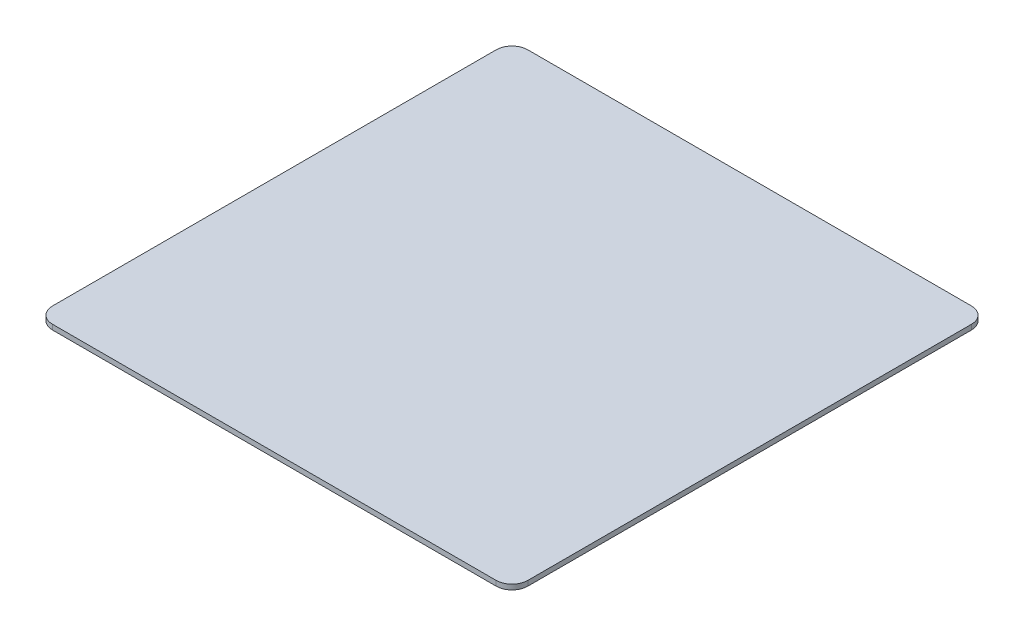
ISO-10303-21;
HEADER;
FILE_DESCRIPTION(('STEP AP214'),'2;1');
FILE_NAME('part.step','',(''),(''),'','','');
FILE_SCHEMA(('AUTOMOTIVE_DESIGN { 1 0 10303 214 1 1 1 1 }'));
ENDSEC;
DATA;
#1=APPLICATION_CONTEXT('core data for automotive mechanical design processes');
#2=APPLICATION_PROTOCOL_DEFINITION('international standard','automotive_design',2000,#1);
#3=PRODUCT_CONTEXT('',#1,'mechanical');
#4=PRODUCT('Part','Part','',(#3));
#5=PRODUCT_RELATED_PRODUCT_CATEGORY('part','',(#4));
#6=PRODUCT_DEFINITION_FORMATION('','',#4);
#7=PRODUCT_DEFINITION_CONTEXT('part definition',#1,'design');
#8=PRODUCT_DEFINITION('design','',#6,#7);
#9=PRODUCT_DEFINITION_SHAPE('','',#8);
#10=(LENGTH_UNIT() NAMED_UNIT(*) SI_UNIT(.MILLI.,.METRE.));
#11=(NAMED_UNIT(*) PLANE_ANGLE_UNIT() SI_UNIT($,.RADIAN.));
#12=(NAMED_UNIT(*) SI_UNIT($,.STERADIAN.) SOLID_ANGLE_UNIT());
#13=UNCERTAINTY_MEASURE_WITH_UNIT(LENGTH_MEASURE(1.E-05),#10,'distance_accuracy_value','');
#14=(GEOMETRIC_REPRESENTATION_CONTEXT(3) GLOBAL_UNCERTAINTY_ASSIGNED_CONTEXT((#13)) GLOBAL_UNIT_ASSIGNED_CONTEXT((#10,
#11,#12)) REPRESENTATION_CONTEXT('',''));
#15=CARTESIAN_POINT('',(0.,0.,0.));
#16=DIRECTION('',(0.,0.,1.));
#17=DIRECTION('',(1.,0.,0.));
#18=AXIS2_PLACEMENT_3D('',#15,#16,#17);
#19=CARTESIAN_POINT('',(-150.,1.5875,150.));
#20=DIRECTION('',(1.,0.,0.));
#21=DIRECTION('',(0.,0.,-1.));
#22=AXIS2_PLACEMENT_3D('',#19,#20,#21);
#23=PLANE('',#22);
#24=DIRECTION('',(0.,0.,1.));
#25=VECTOR('',#24,1.);
#26=CARTESIAN_POINT('',(-150.,1.5875,150.));
#27=LINE('',#26,#25);
#28=CARTESIAN_POINT('',(-150.,1.5875,-140.));
#29=VERTEX_POINT('',#28);
#30=CARTESIAN_POINT('',(-150.,1.5875,140.));
#31=VERTEX_POINT('',#30);
#32=EDGE_CURVE('E119',#29,#31,#27,.T.);
#33=ORIENTED_EDGE('',*,*,#32,.F.);
#34=DIRECTION('',(0.,-1.,0.));
#35=VECTOR('',#34,1.);
#36=CARTESIAN_POINT('',(-150.,1.5875,-140.));
#37=LINE('',#36,#35);
#38=CARTESIAN_POINT('',(-150.,-1.5875,-140.));
#39=VERTEX_POINT('',#38);
#40=EDGE_CURVE('E104',#29,#39,#37,.T.);
#41=ORIENTED_EDGE('',*,*,#40,.T.);
#42=DIRECTION('',(0.,0.,1.));
#43=VECTOR('',#42,1.);
#44=CARTESIAN_POINT('',(-150.,-1.5875,150.));
#45=LINE('',#44,#43);
#46=CARTESIAN_POINT('',(-150.,-1.5875,140.));
#47=VERTEX_POINT('',#46);
#48=EDGE_CURVE('E116',#39,#47,#45,.T.);
#49=ORIENTED_EDGE('',*,*,#48,.T.);
#50=DIRECTION('',(0.,-1.,0.));
#51=VECTOR('',#50,1.);
#52=CARTESIAN_POINT('',(-150.,1.5875,140.));
#53=LINE('',#52,#51);
#54=EDGE_CURVE('E121',#47,#31,#53,.F.);
#55=ORIENTED_EDGE('',*,*,#54,.T.);
#56=EDGE_LOOP('',(#33,#41,#49,#55));
#57=FACE_BOUND('',#56,.T.);
#58=ADVANCED_FACE('F34',(#57),#23,.F.);
#59=CARTESIAN_POINT('',(150.,1.5875,150.));
#60=DIRECTION('',(0.,0.,-1.));
#61=DIRECTION('',(-1.,0.,0.));
#62=AXIS2_PLACEMENT_3D('',#59,#60,#61);
#63=PLANE('',#62);
#64=DIRECTION('',(1.,0.,0.));
#65=VECTOR('',#64,1.);
#66=CARTESIAN_POINT('',(150.,1.5875,150.));
#67=LINE('',#66,#65);
#68=CARTESIAN_POINT('',(-140.,1.5875,150.));
#69=VERTEX_POINT('',#68);
#70=CARTESIAN_POINT('',(140.,1.5875,150.));
#71=VERTEX_POINT('',#70);
#72=EDGE_CURVE('E161',#69,#71,#67,.T.);
#73=ORIENTED_EDGE('',*,*,#72,.F.);
#74=DIRECTION('',(0.,-1.,0.));
#75=VECTOR('',#74,1.);
#76=CARTESIAN_POINT('',(-140.,1.5875,150.));
#77=LINE('',#76,#75);
#78=CARTESIAN_POINT('',(-140.,-1.5875,150.));
#79=VERTEX_POINT('',#78);
#80=EDGE_CURVE('E154',#69,#79,#77,.T.);
#81=ORIENTED_EDGE('',*,*,#80,.T.);
#82=DIRECTION('',(1.,0.,0.));
#83=VECTOR('',#82,1.);
#84=CARTESIAN_POINT('',(150.,-1.5875,150.));
#85=LINE('',#84,#83);
#86=CARTESIAN_POINT('',(140.,-1.5875,150.));
#87=VERTEX_POINT('',#86);
#88=EDGE_CURVE('E125',#79,#87,#85,.T.);
#89=ORIENTED_EDGE('',*,*,#88,.T.);
#90=DIRECTION('',(0.,-1.,0.));
#91=VECTOR('',#90,1.);
#92=CARTESIAN_POINT('',(140.,1.5875,150.));
#93=LINE('',#92,#91);
#94=EDGE_CURVE('E152',#87,#71,#93,.F.);
#95=ORIENTED_EDGE('',*,*,#94,.T.);
#96=EDGE_LOOP('',(#73,#81,#89,#95));
#97=FACE_BOUND('',#96,.T.);
#98=ADVANCED_FACE('F159',(#97),#63,.F.);
#99=CARTESIAN_POINT('',(150.,1.5875,150.));
#100=DIRECTION('',(-1.,0.,0.));
#101=DIRECTION('',(0.,0.,1.));
#102=AXIS2_PLACEMENT_3D('',#99,#100,#101);
#103=PLANE('',#102);
#104=DIRECTION('',(0.,0.,-1.));
#105=VECTOR('',#104,1.);
#106=CARTESIAN_POINT('',(150.,1.5875,150.));
#107=LINE('',#106,#105);
#108=CARTESIAN_POINT('',(150.,1.5875,140.));
#109=VERTEX_POINT('',#108);
#110=CARTESIAN_POINT('',(150.,1.5875,-140.));
#111=VERTEX_POINT('',#110);
#112=EDGE_CURVE('E169',#109,#111,#107,.T.);
#113=ORIENTED_EDGE('',*,*,#112,.F.);
#114=DIRECTION('',(0.,-1.,0.));
#115=VECTOR('',#114,1.);
#116=CARTESIAN_POINT('',(150.,1.5875,140.));
#117=LINE('',#116,#115);
#118=CARTESIAN_POINT('',(150.,-1.5875,140.));
#119=VERTEX_POINT('',#118);
#120=EDGE_CURVE('E11',#109,#119,#117,.T.);
#121=ORIENTED_EDGE('',*,*,#120,.T.);
#122=DIRECTION('',(0.,0.,-1.));
#123=VECTOR('',#122,1.);
#124=CARTESIAN_POINT('',(150.,-1.5875,150.));
#125=LINE('',#124,#123);
#126=CARTESIAN_POINT('',(150.,-1.5875,-140.));
#127=VERTEX_POINT('',#126);
#128=EDGE_CURVE('E128',#119,#127,#125,.T.);
#129=ORIENTED_EDGE('',*,*,#128,.T.);
#130=DIRECTION('',(0.,-1.,0.));
#131=VECTOR('',#130,1.);
#132=CARTESIAN_POINT('',(150.,1.5875,-140.));
#133=LINE('',#132,#131);
#134=EDGE_CURVE('E42',#127,#111,#133,.F.);
#135=ORIENTED_EDGE('',*,*,#134,.T.);
#136=EDGE_LOOP('',(#113,#121,#129,#135));
#137=FACE_BOUND('',#136,.T.);
#138=ADVANCED_FACE('F168',(#137),#103,.F.);
#139=CARTESIAN_POINT('',(150.,1.5875,-150.));
#140=DIRECTION('',(0.,0.,1.));
#141=DIRECTION('',(1.,0.,0.));
#142=AXIS2_PLACEMENT_3D('',#139,#140,#141);
#143=PLANE('',#142);
#144=DIRECTION('',(-1.,0.,0.));
#145=VECTOR('',#144,1.);
#146=CARTESIAN_POINT('',(150.,-1.5875,-150.));
#147=LINE('',#146,#145);
#148=CARTESIAN_POINT('',(140.,-1.5875,-150.));
#149=VERTEX_POINT('',#148);
#150=CARTESIAN_POINT('',(-140.,-1.5875,-150.));
#151=VERTEX_POINT('',#150);
#152=EDGE_CURVE('E135',#149,#151,#147,.T.);
#153=ORIENTED_EDGE('',*,*,#152,.T.);
#154=DIRECTION('',(0.,-1.,0.));
#155=VECTOR('',#154,1.);
#156=CARTESIAN_POINT('',(-140.,1.5875,-150.));
#157=LINE('',#156,#155);
#158=CARTESIAN_POINT('',(-140.,1.5875,-150.));
#159=VERTEX_POINT('',#158);
#160=EDGE_CURVE('E105',#151,#159,#157,.F.);
#161=ORIENTED_EDGE('',*,*,#160,.T.);
#162=DIRECTION('',(-1.,0.,0.));
#163=VECTOR('',#162,1.);
#164=CARTESIAN_POINT('',(150.,1.5875,-150.));
#165=LINE('',#164,#163);
#166=CARTESIAN_POINT('',(140.,1.5875,-150.));
#167=VERTEX_POINT('',#166);
#168=EDGE_CURVE('E131',#167,#159,#165,.T.);
#169=ORIENTED_EDGE('',*,*,#168,.F.);
#170=DIRECTION('',(0.,-1.,0.));
#171=VECTOR('',#170,1.);
#172=CARTESIAN_POINT('',(140.,1.5875,-150.));
#173=LINE('',#172,#171);
#174=EDGE_CURVE('E110',#167,#149,#173,.T.);
#175=ORIENTED_EDGE('',*,*,#174,.T.);
#176=EDGE_LOOP('',(#153,#161,#169,#175));
#177=FACE_BOUND('',#176,.T.);
#178=ADVANCED_FACE('F192',(#177),#143,.F.);
#179=CARTESIAN_POINT('',(0.,1.5875,0.));
#180=DIRECTION('',(0.,1.,0.));
#181=DIRECTION('',(0.,0.,1.));
#182=AXIS2_PLACEMENT_3D('',#179,#180,#181);
#183=PLANE('',#182);
#184=ORIENTED_EDGE('',*,*,#168,.T.);
#185=CARTESIAN_POINT('',(-140.,1.5875,-140.));
#186=DIRECTION('',(0.,1.,0.));
#187=DIRECTION('',(0.,0.,1.));
#188=AXIS2_PLACEMENT_3D('',#185,#186,#187);
#189=CIRCLE('',#188,10.);
#190=EDGE_CURVE('E150',#159,#29,#189,.T.);
#191=ORIENTED_EDGE('',*,*,#190,.T.);
#192=ORIENTED_EDGE('',*,*,#32,.T.);
#193=CARTESIAN_POINT('',(-140.,1.5875,140.));
#194=DIRECTION('',(0.,1.,0.));
#195=DIRECTION('',(0.,0.,1.));
#196=AXIS2_PLACEMENT_3D('',#193,#194,#195);
#197=CIRCLE('',#196,10.);
#198=EDGE_CURVE('E148',#31,#69,#197,.T.);
#199=ORIENTED_EDGE('',*,*,#198,.T.);
#200=ORIENTED_EDGE('',*,*,#72,.T.);
#201=CARTESIAN_POINT('',(140.,1.5875,140.));
#202=DIRECTION('',(0.,1.,0.));
#203=DIRECTION('',(0.,0.,1.));
#204=AXIS2_PLACEMENT_3D('',#201,#202,#203);
#205=CIRCLE('',#204,10.);
#206=EDGE_CURVE('E55',#71,#109,#205,.T.);
#207=ORIENTED_EDGE('',*,*,#206,.T.);
#208=ORIENTED_EDGE('',*,*,#112,.T.);
#209=CARTESIAN_POINT('',(140.,1.5875,-140.));
#210=DIRECTION('',(0.,1.,0.));
#211=DIRECTION('',(0.,0.,1.));
#212=AXIS2_PLACEMENT_3D('',#209,#210,#211);
#213=CIRCLE('',#212,10.);
#214=EDGE_CURVE('E145',#111,#167,#213,.T.);
#215=ORIENTED_EDGE('',*,*,#214,.T.);
#216=EDGE_LOOP('',(#184,#191,#192,#199,#200,#207,#208,#215));
#217=FACE_BOUND('',#216,.T.);
#218=ADVANCED_FACE('F174',(#217),#183,.T.);
#219=CARTESIAN_POINT('',(0.,-1.5875,0.));
#220=DIRECTION('',(0.,1.,0.));
#221=DIRECTION('',(0.,0.,1.));
#222=AXIS2_PLACEMENT_3D('',#219,#220,#221);
#223=PLANE('',#222);
#224=ORIENTED_EDGE('',*,*,#48,.F.);
#225=CARTESIAN_POINT('',(-140.,-1.5875,-140.));
#226=DIRECTION('',(0.,1.,0.));
#227=DIRECTION('',(0.,0.,1.));
#228=AXIS2_PLACEMENT_3D('',#225,#226,#227);
#229=CIRCLE('',#228,10.);
#230=EDGE_CURVE('E100',#39,#151,#229,.F.);
#231=ORIENTED_EDGE('',*,*,#230,.T.);
#232=ORIENTED_EDGE('',*,*,#152,.F.);
#233=CARTESIAN_POINT('',(140.,-1.5875,-140.));
#234=DIRECTION('',(0.,1.,0.));
#235=DIRECTION('',(0.,0.,1.));
#236=AXIS2_PLACEMENT_3D('',#233,#234,#235);
#237=CIRCLE('',#236,10.);
#238=EDGE_CURVE('E120',#149,#127,#237,.F.);
#239=ORIENTED_EDGE('',*,*,#238,.T.);
#240=ORIENTED_EDGE('',*,*,#128,.F.);
#241=CARTESIAN_POINT('',(140.,-1.5875,140.));
#242=DIRECTION('',(0.,1.,0.));
#243=DIRECTION('',(0.,0.,1.));
#244=AXIS2_PLACEMENT_3D('',#241,#242,#243);
#245=CIRCLE('',#244,10.);
#246=EDGE_CURVE('E139',#119,#87,#245,.F.);
#247=ORIENTED_EDGE('',*,*,#246,.T.);
#248=ORIENTED_EDGE('',*,*,#88,.F.);
#249=CARTESIAN_POINT('',(-140.,-1.5875,140.));
#250=DIRECTION('',(0.,1.,0.));
#251=DIRECTION('',(0.,0.,1.));
#252=AXIS2_PLACEMENT_3D('',#249,#250,#251);
#253=CIRCLE('',#252,10.);
#254=EDGE_CURVE('E111',#79,#47,#253,.F.);
#255=ORIENTED_EDGE('',*,*,#254,.T.);
#256=EDGE_LOOP('',(#224,#231,#232,#239,#240,#247,#248,#255));
#257=FACE_BOUND('',#256,.T.);
#258=ADVANCED_FACE('F123',(#257),#223,.F.);
#259=CARTESIAN_POINT('',(-140.,1.5875,-140.));
#260=DIRECTION('',(0.,-1.,0.));
#261=DIRECTION('',(0.,0.,-1.));
#262=AXIS2_PLACEMENT_3D('',#259,#260,#261);
#263=CYLINDRICAL_SURFACE('',#262,10.);
#264=ORIENTED_EDGE('',*,*,#190,.F.);
#265=ORIENTED_EDGE('',*,*,#160,.F.);
#266=ORIENTED_EDGE('',*,*,#230,.F.);
#267=ORIENTED_EDGE('',*,*,#40,.F.);
#268=EDGE_LOOP('',(#264,#265,#266,#267));
#269=FACE_BOUND('',#268,.T.);
#270=ADVANCED_FACE('F103',(#269),#263,.T.);
#271=CARTESIAN_POINT('',(-140.,1.5875,140.));
#272=DIRECTION('',(0.,-1.,0.));
#273=DIRECTION('',(0.,0.,-1.));
#274=AXIS2_PLACEMENT_3D('',#271,#272,#273);
#275=CYLINDRICAL_SURFACE('',#274,10.);
#276=ORIENTED_EDGE('',*,*,#198,.F.);
#277=ORIENTED_EDGE('',*,*,#54,.F.);
#278=ORIENTED_EDGE('',*,*,#254,.F.);
#279=ORIENTED_EDGE('',*,*,#80,.F.);
#280=EDGE_LOOP('',(#276,#277,#278,#279));
#281=FACE_BOUND('',#280,.T.);
#282=ADVANCED_FACE('F175',(#281),#275,.T.);
#283=CARTESIAN_POINT('',(140.,1.5875,140.));
#284=DIRECTION('',(0.,-1.,0.));
#285=DIRECTION('',(0.,0.,-1.));
#286=AXIS2_PLACEMENT_3D('',#283,#284,#285);
#287=CYLINDRICAL_SURFACE('',#286,10.);
#288=ORIENTED_EDGE('',*,*,#206,.F.);
#289=ORIENTED_EDGE('',*,*,#94,.F.);
#290=ORIENTED_EDGE('',*,*,#246,.F.);
#291=ORIENTED_EDGE('',*,*,#120,.F.);
#292=EDGE_LOOP('',(#288,#289,#290,#291));
#293=FACE_BOUND('',#292,.T.);
#294=ADVANCED_FACE('F167',(#293),#287,.T.);
#295=CARTESIAN_POINT('',(140.,1.5875,-140.));
#296=DIRECTION('',(0.,-1.,0.));
#297=DIRECTION('',(0.,0.,-1.));
#298=AXIS2_PLACEMENT_3D('',#295,#296,#297);
#299=CYLINDRICAL_SURFACE('',#298,10.);
#300=ORIENTED_EDGE('',*,*,#214,.F.);
#301=ORIENTED_EDGE('',*,*,#134,.F.);
#302=ORIENTED_EDGE('',*,*,#238,.F.);
#303=ORIENTED_EDGE('',*,*,#174,.F.);
#304=EDGE_LOOP('',(#300,#301,#302,#303));
#305=FACE_BOUND('',#304,.T.);
#306=ADVANCED_FACE('F36',(#305),#299,.T.);
#307=CLOSED_SHELL('',(#58,#98,#138,#178,#218,#258,#270,#282,#294,#306));
#308=MANIFOLD_SOLID_BREP('B2',#307);
#309=ADVANCED_BREP_SHAPE_REPRESENTATION('',(#18,#308),#14);
#310=SHAPE_DEFINITION_REPRESENTATION(#9,#309);
ENDSEC;
END-ISO-10303-21;
